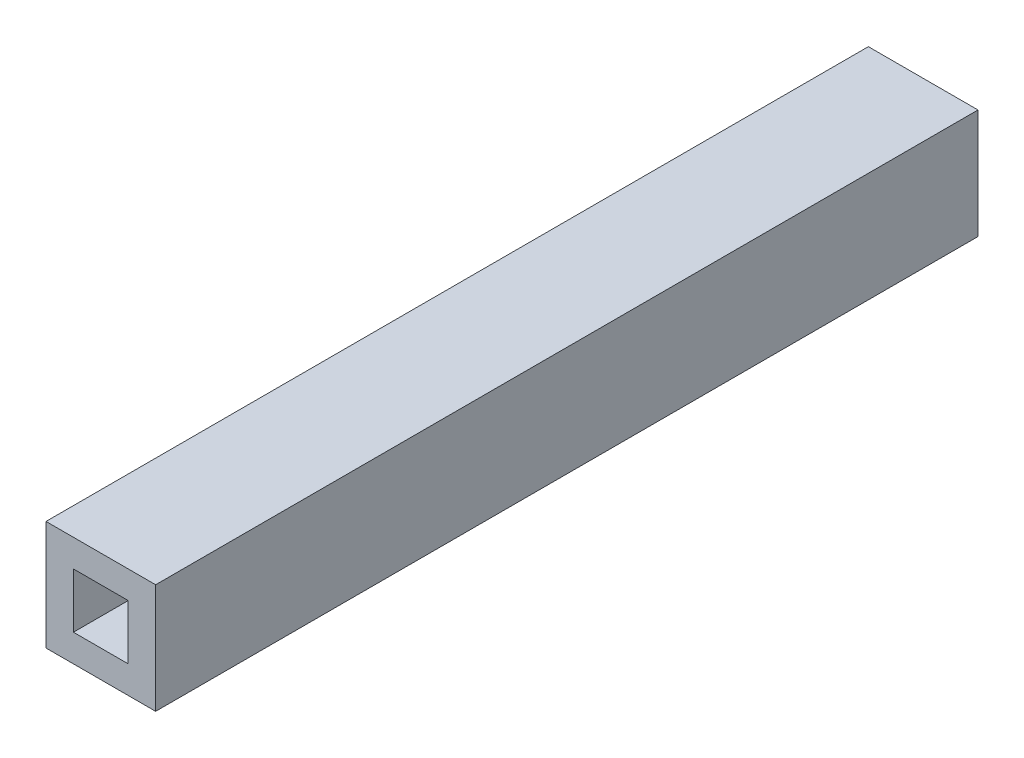
ISO-10303-21;
HEADER;
FILE_DESCRIPTION(('STEP AP214'),'2;1');
FILE_NAME('part.step','',(''),(''),'','','');
FILE_SCHEMA(('AUTOMOTIVE_DESIGN { 1 0 10303 214 1 1 1 1 }'));
ENDSEC;
DATA;
#1=APPLICATION_CONTEXT('core data for automotive mechanical design processes');
#2=APPLICATION_PROTOCOL_DEFINITION('international standard','automotive_design',2000,#1);
#3=PRODUCT_CONTEXT('',#1,'mechanical');
#4=PRODUCT('Part','Part','',(#3));
#5=PRODUCT_RELATED_PRODUCT_CATEGORY('part','',(#4));
#6=PRODUCT_DEFINITION_FORMATION('','',#4);
#7=PRODUCT_DEFINITION_CONTEXT('part definition',#1,'design');
#8=PRODUCT_DEFINITION('design','',#6,#7);
#9=PRODUCT_DEFINITION_SHAPE('','',#8);
#10=(LENGTH_UNIT() NAMED_UNIT(*) SI_UNIT(.MILLI.,.METRE.));
#11=(NAMED_UNIT(*) PLANE_ANGLE_UNIT() SI_UNIT($,.RADIAN.));
#12=(NAMED_UNIT(*) SI_UNIT($,.STERADIAN.) SOLID_ANGLE_UNIT());
#13=UNCERTAINTY_MEASURE_WITH_UNIT(LENGTH_MEASURE(1.E-05),#10,'distance_accuracy_value','');
#14=(GEOMETRIC_REPRESENTATION_CONTEXT(3) GLOBAL_UNCERTAINTY_ASSIGNED_CONTEXT((#13)) GLOBAL_UNIT_ASSIGNED_CONTEXT((#10,
#11,#12)) REPRESENTATION_CONTEXT('',''));
#15=CARTESIAN_POINT('',(0.,0.,0.));
#16=DIRECTION('',(0.,0.,1.));
#17=DIRECTION('',(1.,0.,0.));
#18=AXIS2_PLACEMENT_3D('',#15,#16,#17);
#19=CARTESIAN_POINT('',(0.,0.,150.));
#20=DIRECTION('',(0.,0.,1.));
#21=DIRECTION('',(1.,0.,0.));
#22=AXIS2_PLACEMENT_3D('',#19,#20,#21);
#23=PLANE('',#22);
#24=DIRECTION('',(0.,1.,0.));
#25=VECTOR('',#24,1.);
#26=CARTESIAN_POINT('',(10.,-10.,150.));
#27=LINE('',#26,#25);
#28=CARTESIAN_POINT('',(10.,-10.,150.));
#29=VERTEX_POINT('',#28);
#30=CARTESIAN_POINT('',(10.,10.,150.));
#31=VERTEX_POINT('',#30);
#32=EDGE_CURVE('E158',#29,#31,#27,.T.);
#33=ORIENTED_EDGE('',*,*,#32,.T.);
#34=DIRECTION('',(-1.,0.,0.));
#35=VECTOR('',#34,1.);
#36=CARTESIAN_POINT('',(-10.,10.,150.));
#37=LINE('',#36,#35);
#38=CARTESIAN_POINT('',(-10.,10.,150.));
#39=VERTEX_POINT('',#38);
#40=EDGE_CURVE('E161',#31,#39,#37,.T.);
#41=ORIENTED_EDGE('',*,*,#40,.T.);
#42=DIRECTION('',(0.,-1.,0.));
#43=VECTOR('',#42,1.);
#44=CARTESIAN_POINT('',(-10.,-10.,150.));
#45=LINE('',#44,#43);
#46=CARTESIAN_POINT('',(-10.,-10.,150.));
#47=VERTEX_POINT('',#46);
#48=EDGE_CURVE('E164',#39,#47,#45,.T.);
#49=ORIENTED_EDGE('',*,*,#48,.T.);
#50=DIRECTION('',(1.,0.,0.));
#51=VECTOR('',#50,1.);
#52=CARTESIAN_POINT('',(-10.,-10.,150.));
#53=LINE('',#52,#51);
#54=EDGE_CURVE('E166',#47,#29,#53,.T.);
#55=ORIENTED_EDGE('',*,*,#54,.T.);
#56=EDGE_LOOP('',(#33,#41,#49,#55));
#57=FACE_BOUND('',#56,.T.);
#58=DIRECTION('',(-1.,0.,0.));
#59=VECTOR('',#58,1.);
#60=CARTESIAN_POINT('',(0.,5.,150.));
#61=LINE('',#60,#59);
#62=CARTESIAN_POINT('',(5.,5.,150.));
#63=VERTEX_POINT('',#62);
#64=CARTESIAN_POINT('',(-5.,5.,150.));
#65=VERTEX_POINT('',#64);
#66=EDGE_CURVE('E130',#63,#65,#61,.T.);
#67=ORIENTED_EDGE('',*,*,#66,.F.);
#68=DIRECTION('',(0.,1.,0.));
#69=VECTOR('',#68,1.);
#70=CARTESIAN_POINT('',(5.,0.,150.));
#71=LINE('',#70,#69);
#72=CARTESIAN_POINT('',(5.,-5.,150.));
#73=VERTEX_POINT('',#72);
#74=EDGE_CURVE('E122',#73,#63,#71,.T.);
#75=ORIENTED_EDGE('',*,*,#74,.F.);
#76=DIRECTION('',(1.,0.,0.));
#77=VECTOR('',#76,1.);
#78=CARTESIAN_POINT('',(0.,-5.,150.));
#79=LINE('',#78,#77);
#80=CARTESIAN_POINT('',(-5.,-5.,150.));
#81=VERTEX_POINT('',#80);
#82=EDGE_CURVE('E144',#81,#73,#79,.T.);
#83=ORIENTED_EDGE('',*,*,#82,.F.);
#84=DIRECTION('',(0.,-1.,0.));
#85=VECTOR('',#84,1.);
#86=CARTESIAN_POINT('',(-5.,0.,150.));
#87=LINE('',#86,#85);
#88=EDGE_CURVE('E142',#65,#81,#87,.T.);
#89=ORIENTED_EDGE('',*,*,#88,.F.);
#90=EDGE_LOOP('',(#67,#75,#83,#89));
#91=FACE_BOUND('',#90,.T.);
#92=ADVANCED_FACE('F57',(#57,#91),#23,.T.);
#93=CARTESIAN_POINT('',(0.,0.,0.));
#94=DIRECTION('',(0.,0.,1.));
#95=DIRECTION('',(1.,0.,0.));
#96=AXIS2_PLACEMENT_3D('',#93,#94,#95);
#97=PLANE('',#96);
#98=DIRECTION('',(0.,1.,0.));
#99=VECTOR('',#98,1.);
#100=CARTESIAN_POINT('',(10.,-10.,0.));
#101=LINE('',#100,#99);
#102=CARTESIAN_POINT('',(10.,-10.,0.));
#103=VERTEX_POINT('',#102);
#104=CARTESIAN_POINT('',(10.,10.,0.));
#105=VERTEX_POINT('',#104);
#106=EDGE_CURVE('E138',#103,#105,#101,.T.);
#107=ORIENTED_EDGE('',*,*,#106,.F.);
#108=DIRECTION('',(1.,0.,0.));
#109=VECTOR('',#108,1.);
#110=CARTESIAN_POINT('',(-10.,-10.,0.));
#111=LINE('',#110,#109);
#112=CARTESIAN_POINT('',(-10.,-10.,0.));
#113=VERTEX_POINT('',#112);
#114=EDGE_CURVE('E162',#113,#103,#111,.T.);
#115=ORIENTED_EDGE('',*,*,#114,.F.);
#116=DIRECTION('',(0.,-1.,0.));
#117=VECTOR('',#116,1.);
#118=CARTESIAN_POINT('',(-10.,-10.,0.));
#119=LINE('',#118,#117);
#120=CARTESIAN_POINT('',(-10.,10.,0.));
#121=VERTEX_POINT('',#120);
#122=EDGE_CURVE('E173',#121,#113,#119,.T.);
#123=ORIENTED_EDGE('',*,*,#122,.F.);
#124=DIRECTION('',(-1.,0.,0.));
#125=VECTOR('',#124,1.);
#126=CARTESIAN_POINT('',(-10.,10.,0.));
#127=LINE('',#126,#125);
#128=EDGE_CURVE('E171',#105,#121,#127,.T.);
#129=ORIENTED_EDGE('',*,*,#128,.F.);
#130=EDGE_LOOP('',(#107,#115,#123,#129));
#131=FACE_BOUND('',#130,.T.);
#132=DIRECTION('',(0.,1.,0.));
#133=VECTOR('',#132,1.);
#134=CARTESIAN_POINT('',(5.,0.,0.));
#135=LINE('',#134,#133);
#136=CARTESIAN_POINT('',(5.,-5.,0.));
#137=VERTEX_POINT('',#136);
#138=CARTESIAN_POINT('',(5.,5.,0.));
#139=VERTEX_POINT('',#138);
#140=EDGE_CURVE('E80',#137,#139,#135,.T.);
#141=ORIENTED_EDGE('',*,*,#140,.T.);
#142=DIRECTION('',(-1.,0.,0.));
#143=VECTOR('',#142,1.);
#144=CARTESIAN_POINT('',(0.,5.,0.));
#145=LINE('',#144,#143);
#146=CARTESIAN_POINT('',(-5.,5.,0.));
#147=VERTEX_POINT('',#146);
#148=EDGE_CURVE('E137',#139,#147,#145,.T.);
#149=ORIENTED_EDGE('',*,*,#148,.T.);
#150=DIRECTION('',(0.,-1.,0.));
#151=VECTOR('',#150,1.);
#152=CARTESIAN_POINT('',(-5.,0.,0.));
#153=LINE('',#152,#151);
#154=CARTESIAN_POINT('',(-5.,-5.,0.));
#155=VERTEX_POINT('',#154);
#156=EDGE_CURVE('E150',#147,#155,#153,.T.);
#157=ORIENTED_EDGE('',*,*,#156,.T.);
#158=DIRECTION('',(1.,0.,0.));
#159=VECTOR('',#158,1.);
#160=CARTESIAN_POINT('',(0.,-5.,0.));
#161=LINE('',#160,#159);
#162=EDGE_CURVE('E131',#155,#137,#161,.T.);
#163=ORIENTED_EDGE('',*,*,#162,.T.);
#164=EDGE_LOOP('',(#141,#149,#157,#163));
#165=FACE_BOUND('',#164,.T.);
#166=ADVANCED_FACE('F191',(#131,#165),#97,.F.);
#167=CARTESIAN_POINT('',(10.,-10.,150.));
#168=DIRECTION('',(-1.,0.,0.));
#169=DIRECTION('',(0.,0.,1.));
#170=AXIS2_PLACEMENT_3D('',#167,#168,#169);
#171=PLANE('',#170);
#172=ORIENTED_EDGE('',*,*,#106,.T.);
#173=DIRECTION('',(0.,0.,-1.));
#174=VECTOR('',#173,1.);
#175=CARTESIAN_POINT('',(10.,10.,150.));
#176=LINE('',#175,#174);
#177=EDGE_CURVE('E12',#31,#105,#176,.T.);
#178=ORIENTED_EDGE('',*,*,#177,.F.);
#179=ORIENTED_EDGE('',*,*,#32,.F.);
#180=DIRECTION('',(0.,0.,-1.));
#181=VECTOR('',#180,1.);
#182=CARTESIAN_POINT('',(10.,-10.,150.));
#183=LINE('',#182,#181);
#184=EDGE_CURVE('E168',#29,#103,#183,.T.);
#185=ORIENTED_EDGE('',*,*,#184,.T.);
#186=EDGE_LOOP('',(#172,#178,#179,#185));
#187=FACE_BOUND('',#186,.T.);
#188=ADVANCED_FACE('F59',(#187),#171,.F.);
#189=CARTESIAN_POINT('',(-10.,10.,150.));
#190=DIRECTION('',(0.,-1.,0.));
#191=DIRECTION('',(0.,0.,-1.));
#192=AXIS2_PLACEMENT_3D('',#189,#190,#191);
#193=PLANE('',#192);
#194=ORIENTED_EDGE('',*,*,#128,.T.);
#195=DIRECTION('',(0.,0.,-1.));
#196=VECTOR('',#195,1.);
#197=CARTESIAN_POINT('',(-10.,10.,150.));
#198=LINE('',#197,#196);
#199=EDGE_CURVE('E65',#39,#121,#198,.T.);
#200=ORIENTED_EDGE('',*,*,#199,.F.);
#201=ORIENTED_EDGE('',*,*,#40,.F.);
#202=ORIENTED_EDGE('',*,*,#177,.T.);
#203=EDGE_LOOP('',(#194,#200,#201,#202));
#204=FACE_BOUND('',#203,.T.);
#205=ADVANCED_FACE('F201',(#204),#193,.F.);
#206=CARTESIAN_POINT('',(-10.,-10.,150.));
#207=DIRECTION('',(1.,0.,0.));
#208=DIRECTION('',(0.,0.,-1.));
#209=AXIS2_PLACEMENT_3D('',#206,#207,#208);
#210=PLANE('',#209);
#211=ORIENTED_EDGE('',*,*,#122,.T.);
#212=DIRECTION('',(0.,0.,-1.));
#213=VECTOR('',#212,1.);
#214=CARTESIAN_POINT('',(-10.,-10.,150.));
#215=LINE('',#214,#213);
#216=EDGE_CURVE('E178',#47,#113,#215,.T.);
#217=ORIENTED_EDGE('',*,*,#216,.F.);
#218=ORIENTED_EDGE('',*,*,#48,.F.);
#219=ORIENTED_EDGE('',*,*,#199,.T.);
#220=EDGE_LOOP('',(#211,#217,#218,#219));
#221=FACE_BOUND('',#220,.T.);
#222=ADVANCED_FACE('F185',(#221),#210,.F.);
#223=CARTESIAN_POINT('',(-10.,-10.,150.));
#224=DIRECTION('',(0.,1.,0.));
#225=DIRECTION('',(0.,0.,1.));
#226=AXIS2_PLACEMENT_3D('',#223,#224,#225);
#227=PLANE('',#226);
#228=ORIENTED_EDGE('',*,*,#114,.T.);
#229=ORIENTED_EDGE('',*,*,#184,.F.);
#230=ORIENTED_EDGE('',*,*,#54,.F.);
#231=ORIENTED_EDGE('',*,*,#216,.T.);
#232=EDGE_LOOP('',(#228,#229,#230,#231));
#233=FACE_BOUND('',#232,.T.);
#234=ADVANCED_FACE('F195',(#233),#227,.F.);
#235=CARTESIAN_POINT('',(5.,0.,150.));
#236=DIRECTION('',(-1.,0.,0.));
#237=DIRECTION('',(0.,0.,1.));
#238=AXIS2_PLACEMENT_3D('',#235,#236,#237);
#239=PLANE('',#238);
#240=ORIENTED_EDGE('',*,*,#140,.F.);
#241=DIRECTION('',(0.,0.,-1.));
#242=VECTOR('',#241,1.);
#243=CARTESIAN_POINT('',(5.,-5.,150.));
#244=LINE('',#243,#242);
#245=EDGE_CURVE('E126',#73,#137,#244,.T.);
#246=ORIENTED_EDGE('',*,*,#245,.F.);
#247=ORIENTED_EDGE('',*,*,#74,.T.);
#248=DIRECTION('',(0.,0.,-1.));
#249=VECTOR('',#248,1.);
#250=CARTESIAN_POINT('',(5.,5.,150.));
#251=LINE('',#250,#249);
#252=EDGE_CURVE('E125',#63,#139,#251,.T.);
#253=ORIENTED_EDGE('',*,*,#252,.T.);
#254=EDGE_LOOP('',(#240,#246,#247,#253));
#255=FACE_BOUND('',#254,.T.);
#256=ADVANCED_FACE('F124',(#255),#239,.T.);
#257=CARTESIAN_POINT('',(0.,5.,150.));
#258=DIRECTION('',(0.,-1.,0.));
#259=DIRECTION('',(0.,0.,-1.));
#260=AXIS2_PLACEMENT_3D('',#257,#258,#259);
#261=PLANE('',#260);
#262=ORIENTED_EDGE('',*,*,#148,.F.);
#263=ORIENTED_EDGE('',*,*,#252,.F.);
#264=ORIENTED_EDGE('',*,*,#66,.T.);
#265=DIRECTION('',(0.,0.,-1.));
#266=VECTOR('',#265,1.);
#267=CARTESIAN_POINT('',(-5.,5.,150.));
#268=LINE('',#267,#266);
#269=EDGE_CURVE('E139',#65,#147,#268,.T.);
#270=ORIENTED_EDGE('',*,*,#269,.T.);
#271=EDGE_LOOP('',(#262,#263,#264,#270));
#272=FACE_BOUND('',#271,.T.);
#273=ADVANCED_FACE('F134',(#272),#261,.T.);
#274=CARTESIAN_POINT('',(-5.,0.,150.));
#275=DIRECTION('',(1.,0.,0.));
#276=DIRECTION('',(0.,0.,-1.));
#277=AXIS2_PLACEMENT_3D('',#274,#275,#276);
#278=PLANE('',#277);
#279=ORIENTED_EDGE('',*,*,#156,.F.);
#280=ORIENTED_EDGE('',*,*,#269,.F.);
#281=ORIENTED_EDGE('',*,*,#88,.T.);
#282=DIRECTION('',(0.,0.,-1.));
#283=VECTOR('',#282,1.);
#284=CARTESIAN_POINT('',(-5.,-5.,150.));
#285=LINE('',#284,#283);
#286=EDGE_CURVE('E72',#81,#155,#285,.T.);
#287=ORIENTED_EDGE('',*,*,#286,.T.);
#288=EDGE_LOOP('',(#279,#280,#281,#287));
#289=FACE_BOUND('',#288,.T.);
#290=ADVANCED_FACE('F224',(#289),#278,.T.);
#291=CARTESIAN_POINT('',(0.,-5.,150.));
#292=DIRECTION('',(0.,1.,0.));
#293=DIRECTION('',(0.,0.,1.));
#294=AXIS2_PLACEMENT_3D('',#291,#292,#293);
#295=PLANE('',#294);
#296=ORIENTED_EDGE('',*,*,#162,.F.);
#297=ORIENTED_EDGE('',*,*,#286,.F.);
#298=ORIENTED_EDGE('',*,*,#82,.T.);
#299=ORIENTED_EDGE('',*,*,#245,.T.);
#300=EDGE_LOOP('',(#296,#297,#298,#299));
#301=FACE_BOUND('',#300,.T.);
#302=ADVANCED_FACE('F228',(#301),#295,.T.);
#303=CLOSED_SHELL('',(#92,#166,#188,#205,#222,#234,#256,#273,#290,#302));
#304=MANIFOLD_SOLID_BREP('B2',#303);
#305=ADVANCED_BREP_SHAPE_REPRESENTATION('',(#18,#304),#14);
#306=SHAPE_DEFINITION_REPRESENTATION(#9,#305);
ENDSEC;
END-ISO-10303-21;
